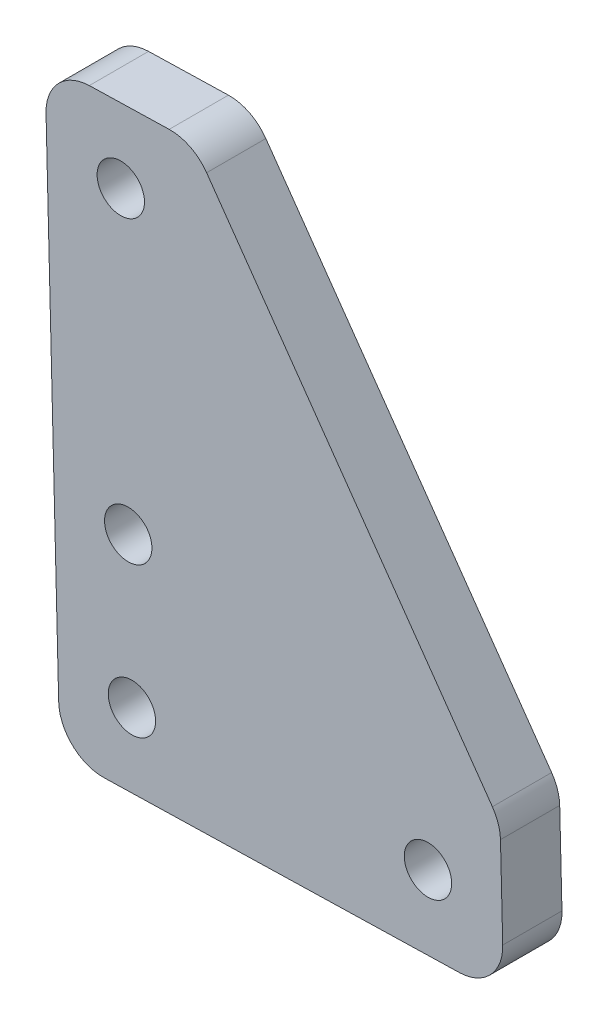
ISO-10303-21;
HEADER;
FILE_DESCRIPTION(('STEP AP214'),'2;1');
FILE_NAME('part.step','',(''),(''),'','','');
FILE_SCHEMA(('AUTOMOTIVE_DESIGN { 1 0 10303 214 1 1 1 1 }'));
ENDSEC;
DATA;
#1=APPLICATION_CONTEXT('core data for automotive mechanical design processes');
#2=APPLICATION_PROTOCOL_DEFINITION('international standard','automotive_design',2000,#1);
#3=PRODUCT_CONTEXT('',#1,'mechanical');
#4=PRODUCT('Part','Part','',(#3));
#5=PRODUCT_RELATED_PRODUCT_CATEGORY('part','',(#4));
#6=PRODUCT_DEFINITION_FORMATION('','',#4);
#7=PRODUCT_DEFINITION_CONTEXT('part definition',#1,'design');
#8=PRODUCT_DEFINITION('design','',#6,#7);
#9=PRODUCT_DEFINITION_SHAPE('','',#8);
#10=(LENGTH_UNIT() NAMED_UNIT(*) SI_UNIT(.MILLI.,.METRE.));
#11=(NAMED_UNIT(*) PLANE_ANGLE_UNIT() SI_UNIT($,.RADIAN.));
#12=(NAMED_UNIT(*) SI_UNIT($,.STERADIAN.) SOLID_ANGLE_UNIT());
#13=UNCERTAINTY_MEASURE_WITH_UNIT(LENGTH_MEASURE(1.E-05),#10,'distance_accuracy_value','');
#14=(GEOMETRIC_REPRESENTATION_CONTEXT(3) GLOBAL_UNCERTAINTY_ASSIGNED_CONTEXT((#13)) GLOBAL_UNIT_ASSIGNED_CONTEXT((#10,
#11,#12)) REPRESENTATION_CONTEXT('',''));
#15=CARTESIAN_POINT('',(0.,0.,0.));
#16=DIRECTION('',(0.,0.,1.));
#17=DIRECTION('',(1.,0.,0.));
#18=AXIS2_PLACEMENT_3D('',#15,#16,#17);
#19=CARTESIAN_POINT('',(28.8962061636077,0.725883232636647,4.));
#20=DIRECTION('',(0.999684632890079,0.0251124424026753,0.));
#21=DIRECTION('',(-0.0251124424026753,0.999684632890079,0.));
#22=AXIS2_PLACEMENT_3D('',#19,#20,#21);
#23=PLANE('',#22);
#24=DIRECTION('',(0.0251124424026753,-0.999684632890079,0.));
#25=VECTOR('',#24,1.);
#26=CARTESIAN_POINT('',(28.8962061636077,0.725883232636647,4.));
#27=LINE('',#26,#25);
#28=CARTESIAN_POINT('',(28.7578305921445,6.23438496022814,4.));
#29=VERTEX_POINT('',#28);
#30=CARTESIAN_POINT('',(28.9108073816728,0.144632986760087,4.));
#31=VERTEX_POINT('',#30);
#32=EDGE_CURVE('E172',#29,#31,#27,.T.);
#33=ORIENTED_EDGE('',*,*,#32,.T.);
#34=DIRECTION('',(0.,0.,-1.));
#35=VECTOR('',#34,1.);
#36=CARTESIAN_POINT('',(28.9108073816728,0.144632986760088,0.));
#37=LINE('',#36,#35);
#38=CARTESIAN_POINT('',(28.9108073816728,0.144632986760087,0.));
#39=VERTEX_POINT('',#38);
#40=EDGE_CURVE('E208',#31,#39,#37,.T.);
#41=ORIENTED_EDGE('',*,*,#40,.T.);
#42=DIRECTION('',(0.0251124424026753,-0.999684632890079,0.));
#43=VECTOR('',#42,1.);
#44=CARTESIAN_POINT('',(28.8962061636077,0.725883232636647,0.));
#45=LINE('',#44,#43);
#46=CARTESIAN_POINT('',(28.7578305921445,6.23438496022814,0.));
#47=VERTEX_POINT('',#46);
#48=EDGE_CURVE('E230',#47,#39,#45,.T.);
#49=ORIENTED_EDGE('',*,*,#48,.F.);
#50=DIRECTION('',(0.,0.,-1.));
#51=VECTOR('',#50,1.);
#52=CARTESIAN_POINT('',(28.7578305921445,6.23438496022814,4.));
#53=LINE('',#52,#51);
#54=EDGE_CURVE('E205',#47,#29,#53,.F.);
#55=ORIENTED_EDGE('',*,*,#54,.T.);
#56=EDGE_LOOP('',(#33,#41,#49,#55));
#57=FACE_BOUND('',#56,.T.);
#58=ADVANCED_FACE('F41',(#57),#23,.T.);
#59=CARTESIAN_POINT('',(22.5819281282891,15.8879592373319,4.));
#60=DIRECTION('',(0.81785801631275,0.575420077120163,0.));
#61=DIRECTION('',(-0.575420077120163,0.81785801631275,0.));
#62=AXIS2_PLACEMENT_3D('',#59,#60,#61);
#63=PLANE('',#62);
#64=DIRECTION('',(0.575420077120163,-0.81785801631275,0.));
#65=VECTOR('',#64,1.);
#66=CARTESIAN_POINT('',(22.5819281282891,15.8879592373319,4.));
#67=LINE('',#66,#65);
#68=CARTESIAN_POINT('',(8.91182079371999,35.3176025744001,4.));
#69=VERTEX_POINT('',#68);
#70=CARTESIAN_POINT('',(28.2123507424125,7.8853078643806,4.));
#71=VERTEX_POINT('',#70);
#72=EDGE_CURVE('E258',#69,#71,#67,.T.);
#73=ORIENTED_EDGE('',*,*,#72,.T.);
#74=DIRECTION('',(0.,0.,-1.));
#75=VECTOR('',#74,1.);
#76=CARTESIAN_POINT('',(28.2123507424125,7.8853078643806,4.));
#77=LINE('',#76,#75);
#78=CARTESIAN_POINT('',(28.2123507424125,7.8853078643806,0.));
#79=VERTEX_POINT('',#78);
#80=EDGE_CURVE('E215',#71,#79,#77,.T.);
#81=ORIENTED_EDGE('',*,*,#80,.T.);
#82=DIRECTION('',(0.575420077120163,-0.81785801631275,0.));
#83=VECTOR('',#82,1.);
#84=CARTESIAN_POINT('',(22.5819281282891,15.8879592373319,0.));
#85=LINE('',#84,#83);
#86=CARTESIAN_POINT('',(8.91182079371999,35.3176025744001,0.));
#87=VERTEX_POINT('',#86);
#88=EDGE_CURVE('E228',#87,#79,#85,.T.);
#89=ORIENTED_EDGE('',*,*,#88,.F.);
#90=DIRECTION('',(0.,0.,-1.));
#91=VECTOR('',#90,1.);
#92=CARTESIAN_POINT('',(8.91182079371999,35.3176025744001,4.));
#93=LINE('',#92,#91);
#94=EDGE_CURVE('E212',#87,#69,#93,.F.);
#95=ORIENTED_EDGE('',*,*,#94,.T.);
#96=EDGE_LOOP('',(#73,#81,#89,#95));
#97=FACE_BOUND('',#96,.T.);
#98=ADVANCED_FACE('F291',(#97),#63,.T.);
#99=CARTESIAN_POINT('',(-0.914559150834067,36.4070811710564,4.));
#100=DIRECTION('',(-0.0251124424026791,0.999684632890079,0.));
#101=DIRECTION('',(-0.999684632890079,-0.0251124424026791,0.));
#102=AXIS2_PLACEMENT_3D('',#99,#100,#101);
#103=PLANE('',#102);
#104=DIRECTION('',(0.999684632890079,0.0251124424026791,0.));
#105=VECTOR('',#104,1.);
#106=CARTESIAN_POINT('',(-0.914559150834067,36.4070811710564,0.));
#107=LINE('',#106,#105);
#108=CARTESIAN_POINT('',(0.990161924741565,36.4549284588208,0.));
#109=VERTEX_POINT('',#108);
#110=CARTESIAN_POINT('',(6.38290941757371,36.5903962417099,0.));
#111=VERTEX_POINT('',#110);
#112=EDGE_CURVE('E157',#109,#111,#107,.T.);
#113=ORIENTED_EDGE('',*,*,#112,.F.);
#114=DIRECTION('',(0.,0.,-1.));
#115=VECTOR('',#114,1.);
#116=CARTESIAN_POINT('',(0.990161924741564,36.4549284588208,4.));
#117=LINE('',#116,#115);
#118=CARTESIAN_POINT('',(0.990161924741565,36.4549284588208,4.));
#119=VERTEX_POINT('',#118);
#120=EDGE_CURVE('E11',#109,#119,#117,.F.);
#121=ORIENTED_EDGE('',*,*,#120,.T.);
#122=DIRECTION('',(0.999684632890079,0.0251124424026791,0.));
#123=VECTOR('',#122,1.);
#124=CARTESIAN_POINT('',(-0.914559150834067,36.4070811710564,4.));
#125=LINE('',#124,#123);
#126=CARTESIAN_POINT('',(6.38290941757371,36.5903962417099,4.));
#127=VERTEX_POINT('',#126);
#128=EDGE_CURVE('E223',#119,#127,#125,.T.);
#129=ORIENTED_EDGE('',*,*,#128,.T.);
#130=DIRECTION('',(0.,0.,-1.));
#131=VECTOR('',#130,1.);
#132=CARTESIAN_POINT('',(6.38290941757371,36.5903962417099,4.));
#133=LINE('',#132,#131);
#134=EDGE_CURVE('E50',#127,#111,#133,.T.);
#135=ORIENTED_EDGE('',*,*,#134,.T.);
#136=EDGE_LOOP('',(#113,#121,#129,#135));
#137=FACE_BOUND('',#136,.T.);
#138=ADVANCED_FACE('F222',(#137),#103,.T.);
#139=CARTESIAN_POINT('',(-1.0943328230946,-0.0274900394436155,4.));
#140=DIRECTION('',(-0.999684632890079,-0.0251124424026792,0.));
#141=DIRECTION('',(0.0251124424026792,-0.999684632890079,0.));
#142=AXIS2_PLACEMENT_3D('',#139,#140,#141);
#143=PLANE('',#142);
#144=DIRECTION('',(-0.0251124424026792,0.999684632890079,0.));
#145=VECTOR('',#144,1.);
#146=CARTESIAN_POINT('',(-1.0943328230946,-0.0274900394436155,0.));
#147=LINE('',#146,#145);
#148=CARTESIAN_POINT('',(-1.07973160502954,-0.608740285320186,0.));
#149=VERTEX_POINT('',#148);
#150=CARTESIAN_POINT('',(-1.93355464672064,33.3805372329425,0.));
#151=VERTEX_POINT('',#150);
#152=EDGE_CURVE('E150',#149,#151,#147,.T.);
#153=ORIENTED_EDGE('',*,*,#152,.F.);
#154=DIRECTION('',(0.,0.,-1.));
#155=VECTOR('',#154,1.);
#156=CARTESIAN_POINT('',(-1.07973160502954,-0.608740285320186,4.));
#157=LINE('',#156,#155);
#158=CARTESIAN_POINT('',(-1.07973160502954,-0.608740285320186,4.));
#159=VERTEX_POINT('',#158);
#160=EDGE_CURVE('E124',#149,#159,#157,.F.);
#161=ORIENTED_EDGE('',*,*,#160,.T.);
#162=DIRECTION('',(-0.0251124424026792,0.999684632890079,0.));
#163=VECTOR('',#162,1.);
#164=CARTESIAN_POINT('',(-1.0943328230946,-0.0274900394436155,4.));
#165=LINE('',#164,#163);
#166=CARTESIAN_POINT('',(-1.93355464672064,33.3805372329425,4.));
#167=VERTEX_POINT('',#166);
#168=EDGE_CURVE('E252',#159,#167,#165,.T.);
#169=ORIENTED_EDGE('',*,*,#168,.T.);
#170=DIRECTION('',(0.,0.,-1.));
#171=VECTOR('',#170,1.);
#172=CARTESIAN_POINT('',(-1.93355464672064,33.3805372329425,4.));
#173=LINE('',#172,#171);
#174=EDGE_CURVE('E130',#167,#151,#173,.T.);
#175=ORIENTED_EDGE('',*,*,#174,.T.);
#176=EDGE_LOOP('',(#153,#161,#169,#175));
#177=FACE_BOUND('',#176,.T.);
#178=ADVANCED_FACE('F279',(#177),#143,.T.);
#179=CARTESIAN_POINT('',(3.86846667461547,1.51619119247336,4.));
#180=DIRECTION('',(0.,0.,-1.));
#181=DIRECTION('',(-1.,0.,0.));
#182=AXIS2_PLACEMENT_3D('',#179,#180,#181);
#183=CYLINDRICAL_SURFACE('',#182,1.6);
#184=CARTESIAN_POINT('',(3.86846667461547,1.51619119247336,4.));
#185=DIRECTION('',(0.,0.,1.));
#186=DIRECTION('',(1.,0.,0.));
#187=AXIS2_PLACEMENT_3D('',#184,#185,#186);
#188=CIRCLE('',#187,1.6);
#189=CARTESIAN_POINT('',(5.46846667461547,1.51619119247336,4.));
#190=VERTEX_POINT('',#189);
#191=EDGE_CURVE('E238',#190,#190,#188,.T.);
#192=ORIENTED_EDGE('',*,*,#191,.T.);
#193=EDGE_LOOP('',(#192));
#194=FACE_BOUND('',#193,.T.);
#195=CARTESIAN_POINT('',(3.86846667461547,1.51619119247336,0.));
#196=DIRECTION('',(0.,0.,1.));
#197=DIRECTION('',(1.,0.,0.));
#198=AXIS2_PLACEMENT_3D('',#195,#196,#197);
#199=CIRCLE('',#198,1.6);
#200=CARTESIAN_POINT('',(5.46846667461547,1.51619119247336,0.));
#201=VERTEX_POINT('',#200);
#202=EDGE_CURVE('E164',#201,#201,#199,.T.);
#203=ORIENTED_EDGE('',*,*,#202,.F.);
#204=EDGE_LOOP('',(#203));
#205=FACE_BOUND('',#204,.T.);
#206=ADVANCED_FACE('F371',(#194,#205),#183,.F.);
#207=CARTESIAN_POINT('',(3.11509340253512,31.5067301791757,4.));
#208=DIRECTION('',(0.,0.,-1.));
#209=DIRECTION('',(-1.,0.,0.));
#210=AXIS2_PLACEMENT_3D('',#207,#208,#209);
#211=CYLINDRICAL_SURFACE('',#210,1.6);
#212=CARTESIAN_POINT('',(3.11509340253512,31.5067301791757,4.));
#213=DIRECTION('',(0.,0.,1.));
#214=DIRECTION('',(1.,0.,0.));
#215=AXIS2_PLACEMENT_3D('',#212,#213,#214);
#216=CIRCLE('',#215,1.6);
#217=CARTESIAN_POINT('',(4.71509340253512,31.5067301791757,4.));
#218=VERTEX_POINT('',#217);
#219=EDGE_CURVE('E242',#218,#218,#216,.T.);
#220=ORIENTED_EDGE('',*,*,#219,.T.);
#221=EDGE_LOOP('',(#220));
#222=FACE_BOUND('',#221,.T.);
#223=CARTESIAN_POINT('',(3.11509340253512,31.5067301791757,0.));
#224=DIRECTION('',(0.,0.,1.));
#225=DIRECTION('',(1.,0.,0.));
#226=AXIS2_PLACEMENT_3D('',#223,#224,#225);
#227=CIRCLE('',#226,1.6);
#228=CARTESIAN_POINT('',(4.71509340253512,31.5067301791757,0.));
#229=VERTEX_POINT('',#228);
#230=EDGE_CURVE('E155',#229,#229,#227,.T.);
#231=ORIENTED_EDGE('',*,*,#230,.F.);
#232=EDGE_LOOP('',(#231));
#233=FACE_BOUND('',#232,.T.);
#234=ADVANCED_FACE('F406',(#222,#233),#211,.F.);
#235=CARTESIAN_POINT('',(3.6173422505887,11.5130375213742,4.));
#236=DIRECTION('',(0.,0.,-1.));
#237=DIRECTION('',(-1.,0.,0.));
#238=AXIS2_PLACEMENT_3D('',#235,#236,#237);
#239=CYLINDRICAL_SURFACE('',#238,1.6);
#240=CARTESIAN_POINT('',(3.6173422505887,11.5130375213742,4.));
#241=DIRECTION('',(0.,0.,1.));
#242=DIRECTION('',(1.,0.,0.));
#243=AXIS2_PLACEMENT_3D('',#240,#241,#242);
#244=CIRCLE('',#243,1.6);
#245=CARTESIAN_POINT('',(5.2173422505887,11.5130375213742,4.));
#246=VERTEX_POINT('',#245);
#247=EDGE_CURVE('E246',#246,#246,#244,.T.);
#248=ORIENTED_EDGE('',*,*,#247,.T.);
#249=EDGE_LOOP('',(#248));
#250=FACE_BOUND('',#249,.T.);
#251=CARTESIAN_POINT('',(3.6173422505887,11.5130375213742,0.));
#252=DIRECTION('',(0.,0.,1.));
#253=DIRECTION('',(1.,0.,0.));
#254=AXIS2_PLACEMENT_3D('',#251,#252,#253);
#255=CIRCLE('',#254,1.6);
#256=CARTESIAN_POINT('',(5.2173422505887,11.5130375213742,0.));
#257=VERTEX_POINT('',#256);
#258=EDGE_CURVE('E149',#257,#257,#255,.T.);
#259=ORIENTED_EDGE('',*,*,#258,.F.);
#260=EDGE_LOOP('',(#259));
#261=FACE_BOUND('',#260,.T.);
#262=ADVANCED_FACE('F359',(#250,#261),#239,.F.);
#263=CARTESIAN_POINT('',(0.089938545273085,-3.5803041445468,4.));
#264=DIRECTION('',(-0.0251124424026754,0.999684632890079,0.));
#265=DIRECTION('',(-0.999684632890079,-0.0251124424026754,0.));
#266=AXIS2_PLACEMENT_3D('',#263,#264,#265);
#267=PLANE('',#266);
#268=DIRECTION('',(0.999684632890079,0.0251124424026755,0.));
#269=VECTOR('',#268,1.);
#270=CARTESIAN_POINT('',(0.089938545273085,-3.5803041445468,4.));
#271=LINE('',#270,#269);
#272=CARTESIAN_POINT('',(1.99465962084872,-3.53245685678239,4.));
#273=VERTEX_POINT('',#272);
#274=CARTESIAN_POINT('',(25.9870908102106,-2.92975823911818,4.));
#275=VERTEX_POINT('',#274);
#276=EDGE_CURVE('E140',#273,#275,#271,.T.);
#277=ORIENTED_EDGE('',*,*,#276,.F.);
#278=DIRECTION('',(0.,0.,-1.));
#279=VECTOR('',#278,1.);
#280=CARTESIAN_POINT('',(1.99465962084872,-3.53245685678239,0.));
#281=LINE('',#280,#279);
#282=CARTESIAN_POINT('',(1.99465962084872,-3.53245685678239,0.));
#283=VERTEX_POINT('',#282);
#284=EDGE_CURVE('E123',#273,#283,#281,.T.);
#285=ORIENTED_EDGE('',*,*,#284,.T.);
#286=DIRECTION('',(0.999684632890079,0.0251124424026755,0.));
#287=VECTOR('',#286,1.);
#288=CARTESIAN_POINT('',(0.089938545273085,-3.5803041445468,0.));
#289=LINE('',#288,#287);
#290=CARTESIAN_POINT('',(25.9870908102106,-2.92975823911818,0.));
#291=VERTEX_POINT('',#290);
#292=EDGE_CURVE('E137',#283,#291,#289,.T.);
#293=ORIENTED_EDGE('',*,*,#292,.T.);
#294=DIRECTION('',(0.,0.,-1.));
#295=VECTOR('',#294,1.);
#296=CARTESIAN_POINT('',(25.9870908102106,-2.92975823911818,4.));
#297=LINE('',#296,#295);
#298=EDGE_CURVE('E143',#291,#275,#297,.F.);
#299=ORIENTED_EDGE('',*,*,#298,.T.);
#300=EDGE_LOOP('',(#277,#285,#293,#299));
#301=FACE_BOUND('',#300,.T.);
#302=ADVANCED_FACE('F136',(#301),#267,.F.);
#303=CARTESIAN_POINT('',(23.8621593324171,2.01844004052687,4.));
#304=DIRECTION('',(0.,0.,-1.));
#305=DIRECTION('',(-1.,0.,0.));
#306=AXIS2_PLACEMENT_3D('',#303,#304,#305);
#307=CYLINDRICAL_SURFACE('',#306,1.6);
#308=CARTESIAN_POINT('',(23.8621593324171,2.01844004052687,4.));
#309=DIRECTION('',(0.,0.,1.));
#310=DIRECTION('',(1.,0.,0.));
#311=AXIS2_PLACEMENT_3D('',#308,#309,#310);
#312=CIRCLE('',#311,1.6);
#313=CARTESIAN_POINT('',(25.4621593324171,2.01844004052687,4.));
#314=VERTEX_POINT('',#313);
#315=EDGE_CURVE('E174',#314,#314,#312,.T.);
#316=ORIENTED_EDGE('',*,*,#315,.T.);
#317=EDGE_LOOP('',(#316));
#318=FACE_BOUND('',#317,.T.);
#319=CARTESIAN_POINT('',(23.8621593324171,2.01844004052687,0.));
#320=DIRECTION('',(0.,0.,1.));
#321=DIRECTION('',(1.,0.,0.));
#322=AXIS2_PLACEMENT_3D('',#319,#320,#321);
#323=CIRCLE('',#322,1.6);
#324=CARTESIAN_POINT('',(25.4621593324171,2.01844004052687,0.));
#325=VERTEX_POINT('',#324);
#326=EDGE_CURVE('E168',#325,#325,#323,.T.);
#327=ORIENTED_EDGE('',*,*,#326,.F.);
#328=EDGE_LOOP('',(#327));
#329=FACE_BOUND('',#328,.T.);
#330=ADVANCED_FACE('F348',(#318,#329),#307,.F.);
#331=CARTESIAN_POINT('',(0.,0.,4.));
#332=DIRECTION('',(0.,0.,1.));
#333=DIRECTION('',(1.,0.,0.));
#334=AXIS2_PLACEMENT_3D('',#331,#332,#333);
#335=PLANE('',#334);
#336=ORIENTED_EDGE('',*,*,#168,.F.);
#337=CARTESIAN_POINT('',(1.91932229364069,-0.533402958112148,4.));
#338=DIRECTION('',(0.,0.,1.));
#339=DIRECTION('',(1.,0.,0.));
#340=AXIS2_PLACEMENT_3D('',#337,#338,#339);
#341=CIRCLE('',#340,3.);
#342=EDGE_CURVE('E202',#159,#273,#341,.T.);
#343=ORIENTED_EDGE('',*,*,#342,.T.);
#344=ORIENTED_EDGE('',*,*,#276,.T.);
#345=CARTESIAN_POINT('',(25.9117534830026,0.0692956595520618,4.));
#346=DIRECTION('',(0.,0.,1.));
#347=DIRECTION('',(1.,0.,0.));
#348=AXIS2_PLACEMENT_3D('',#345,#346,#347);
#349=CIRCLE('',#348,3.);
#350=EDGE_CURVE('E199',#275,#31,#349,.T.);
#351=ORIENTED_EDGE('',*,*,#350,.T.);
#352=ORIENTED_EDGE('',*,*,#32,.F.);
#353=CARTESIAN_POINT('',(25.7587766934743,6.15904763302011,4.));
#354=DIRECTION('',(0.,0.,1.));
#355=DIRECTION('',(1.,0.,0.));
#356=AXIS2_PLACEMENT_3D('',#353,#354,#355);
#357=CIRCLE('',#356,3.);
#358=EDGE_CURVE('E196',#29,#71,#357,.T.);
#359=ORIENTED_EDGE('',*,*,#358,.T.);
#360=ORIENTED_EDGE('',*,*,#72,.F.);
#361=CARTESIAN_POINT('',(6.45824674478174,33.5913423430397,4.));
#362=DIRECTION('',(0.,0.,1.));
#363=DIRECTION('',(1.,0.,0.));
#364=AXIS2_PLACEMENT_3D('',#361,#362,#363);
#365=CIRCLE('',#364,3.);
#366=EDGE_CURVE('E57',#69,#127,#365,.T.);
#367=ORIENTED_EDGE('',*,*,#366,.T.);
#368=ORIENTED_EDGE('',*,*,#128,.F.);
#369=CARTESIAN_POINT('',(1.0654992519496,33.4558745601505,4.));
#370=DIRECTION('',(0.,0.,1.));
#371=DIRECTION('',(1.,0.,0.));
#372=AXIS2_PLACEMENT_3D('',#369,#370,#371);
#373=CIRCLE('',#372,3.);
#374=EDGE_CURVE('E193',#119,#167,#373,.T.);
#375=ORIENTED_EDGE('',*,*,#374,.T.);
#376=EDGE_LOOP('',(#336,#343,#344,#351,#352,#359,#360,#367,#368,#375));
#377=FACE_BOUND('',#376,.T.);
#378=ORIENTED_EDGE('',*,*,#247,.F.);
#379=EDGE_LOOP('',(#378));
#380=FACE_BOUND('',#379,.T.);
#381=ORIENTED_EDGE('',*,*,#219,.F.);
#382=EDGE_LOOP('',(#381));
#383=FACE_BOUND('',#382,.T.);
#384=ORIENTED_EDGE('',*,*,#191,.F.);
#385=EDGE_LOOP('',(#384));
#386=FACE_BOUND('',#385,.T.);
#387=ORIENTED_EDGE('',*,*,#315,.F.);
#388=EDGE_LOOP('',(#387));
#389=FACE_BOUND('',#388,.T.);
#390=ADVANCED_FACE('F274',(#377,#380,#383,#386,#389),#335,.T.);
#391=CARTESIAN_POINT('',(0.,0.,0.));
#392=DIRECTION('',(0.,0.,1.));
#393=DIRECTION('',(1.,0.,0.));
#394=AXIS2_PLACEMENT_3D('',#391,#392,#393);
#395=PLANE('',#394);
#396=ORIENTED_EDGE('',*,*,#292,.F.);
#397=CARTESIAN_POINT('',(1.91932229364069,-0.533402958112148,0.));
#398=DIRECTION('',(0.,0.,1.));
#399=DIRECTION('',(1.,0.,0.));
#400=AXIS2_PLACEMENT_3D('',#397,#398,#399);
#401=CIRCLE('',#400,3.);
#402=EDGE_CURVE('E119',#283,#149,#401,.F.);
#403=ORIENTED_EDGE('',*,*,#402,.T.);
#404=ORIENTED_EDGE('',*,*,#152,.T.);
#405=CARTESIAN_POINT('',(1.0654992519496,33.4558745601505,0.));
#406=DIRECTION('',(0.,0.,1.));
#407=DIRECTION('',(1.,0.,0.));
#408=AXIS2_PLACEMENT_3D('',#405,#406,#407);
#409=CIRCLE('',#408,3.);
#410=EDGE_CURVE('E178',#151,#109,#409,.F.);
#411=ORIENTED_EDGE('',*,*,#410,.T.);
#412=ORIENTED_EDGE('',*,*,#112,.T.);
#413=CARTESIAN_POINT('',(6.45824674478174,33.5913423430397,0.));
#414=DIRECTION('',(0.,0.,1.));
#415=DIRECTION('',(1.,0.,0.));
#416=AXIS2_PLACEMENT_3D('',#413,#414,#415);
#417=CIRCLE('',#416,3.);
#418=EDGE_CURVE('E142',#111,#87,#417,.F.);
#419=ORIENTED_EDGE('',*,*,#418,.T.);
#420=ORIENTED_EDGE('',*,*,#88,.T.);
#421=CARTESIAN_POINT('',(25.7587766934743,6.15904763302011,0.));
#422=DIRECTION('',(0.,0.,1.));
#423=DIRECTION('',(1.,0.,0.));
#424=AXIS2_PLACEMENT_3D('',#421,#422,#423);
#425=CIRCLE('',#424,3.);
#426=EDGE_CURVE('E181',#79,#47,#425,.F.);
#427=ORIENTED_EDGE('',*,*,#426,.T.);
#428=ORIENTED_EDGE('',*,*,#48,.T.);
#429=CARTESIAN_POINT('',(25.9117534830026,0.0692956595520618,0.));
#430=DIRECTION('',(0.,0.,1.));
#431=DIRECTION('',(1.,0.,0.));
#432=AXIS2_PLACEMENT_3D('',#429,#430,#431);
#433=CIRCLE('',#432,3.);
#434=EDGE_CURVE('E131',#39,#291,#433,.F.);
#435=ORIENTED_EDGE('',*,*,#434,.T.);
#436=EDGE_LOOP('',(#396,#403,#404,#411,#412,#419,#420,#427,#428,#435));
#437=FACE_BOUND('',#436,.T.);
#438=ORIENTED_EDGE('',*,*,#258,.T.);
#439=EDGE_LOOP('',(#438));
#440=FACE_BOUND('',#439,.T.);
#441=ORIENTED_EDGE('',*,*,#230,.T.);
#442=EDGE_LOOP('',(#441));
#443=FACE_BOUND('',#442,.T.);
#444=ORIENTED_EDGE('',*,*,#202,.T.);
#445=EDGE_LOOP('',(#444));
#446=FACE_BOUND('',#445,.T.);
#447=ORIENTED_EDGE('',*,*,#326,.T.);
#448=EDGE_LOOP('',(#447));
#449=FACE_BOUND('',#448,.T.);
#450=ADVANCED_FACE('F145',(#437,#440,#443,#446,#449),#395,.F.);
#451=CARTESIAN_POINT('',(1.91932229364069,-0.533402958112148,4.));
#452=DIRECTION('',(0.,0.,1.));
#453=DIRECTION('',(1.,0.,0.));
#454=AXIS2_PLACEMENT_3D('',#451,#452,#453);
#455=CYLINDRICAL_SURFACE('',#454,3.);
#456=ORIENTED_EDGE('',*,*,#342,.F.);
#457=ORIENTED_EDGE('',*,*,#160,.F.);
#458=ORIENTED_EDGE('',*,*,#402,.F.);
#459=ORIENTED_EDGE('',*,*,#284,.F.);
#460=EDGE_LOOP('',(#456,#457,#458,#459));
#461=FACE_BOUND('',#460,.T.);
#462=ADVANCED_FACE('F122',(#461),#455,.T.);
#463=CARTESIAN_POINT('',(25.9117534830026,0.0692956595520618,4.));
#464=DIRECTION('',(0.,0.,1.));
#465=DIRECTION('',(1.,0.,0.));
#466=AXIS2_PLACEMENT_3D('',#463,#464,#465);
#467=CYLINDRICAL_SURFACE('',#466,3.);
#468=ORIENTED_EDGE('',*,*,#350,.F.);
#469=ORIENTED_EDGE('',*,*,#298,.F.);
#470=ORIENTED_EDGE('',*,*,#434,.F.);
#471=ORIENTED_EDGE('',*,*,#40,.F.);
#472=EDGE_LOOP('',(#468,#469,#470,#471));
#473=FACE_BOUND('',#472,.T.);
#474=ADVANCED_FACE('F272',(#473),#467,.T.);
#475=CARTESIAN_POINT('',(25.7587766934743,6.15904763302011,4.));
#476=DIRECTION('',(0.,0.,-1.));
#477=DIRECTION('',(-1.,0.,0.));
#478=AXIS2_PLACEMENT_3D('',#475,#476,#477);
#479=CYLINDRICAL_SURFACE('',#478,3.);
#480=ORIENTED_EDGE('',*,*,#358,.F.);
#481=ORIENTED_EDGE('',*,*,#54,.F.);
#482=ORIENTED_EDGE('',*,*,#426,.F.);
#483=ORIENTED_EDGE('',*,*,#80,.F.);
#484=EDGE_LOOP('',(#480,#481,#482,#483));
#485=FACE_BOUND('',#484,.T.);
#486=ADVANCED_FACE('F283',(#485),#479,.T.);
#487=CARTESIAN_POINT('',(1.0654992519496,33.4558745601505,4.));
#488=DIRECTION('',(0.,0.,-1.));
#489=DIRECTION('',(-1.,0.,0.));
#490=AXIS2_PLACEMENT_3D('',#487,#488,#489);
#491=CYLINDRICAL_SURFACE('',#490,3.);
#492=ORIENTED_EDGE('',*,*,#374,.F.);
#493=ORIENTED_EDGE('',*,*,#120,.F.);
#494=ORIENTED_EDGE('',*,*,#410,.F.);
#495=ORIENTED_EDGE('',*,*,#174,.F.);
#496=EDGE_LOOP('',(#492,#493,#494,#495));
#497=FACE_BOUND('',#496,.T.);
#498=ADVANCED_FACE('F281',(#497),#491,.T.);
#499=CARTESIAN_POINT('',(6.45824674478174,33.5913423430397,4.));
#500=DIRECTION('',(0.,0.,-1.));
#501=DIRECTION('',(-1.,0.,0.));
#502=AXIS2_PLACEMENT_3D('',#499,#500,#501);
#503=CYLINDRICAL_SURFACE('',#502,3.);
#504=ORIENTED_EDGE('',*,*,#366,.F.);
#505=ORIENTED_EDGE('',*,*,#94,.F.);
#506=ORIENTED_EDGE('',*,*,#418,.F.);
#507=ORIENTED_EDGE('',*,*,#134,.F.);
#508=EDGE_LOOP('',(#504,#505,#506,#507));
#509=FACE_BOUND('',#508,.T.);
#510=ADVANCED_FACE('F43',(#509),#503,.T.);
#511=CLOSED_SHELL('',(#58,#98,#138,#178,#206,#234,#262,#302,#330,#390,#450,#462,#474,#486,#498,#510));
#512=MANIFOLD_SOLID_BREP('B2',#511);
#513=ADVANCED_BREP_SHAPE_REPRESENTATION('',(#18,#512),#14);
#514=SHAPE_DEFINITION_REPRESENTATION(#9,#513);
ENDSEC;
END-ISO-10303-21;
